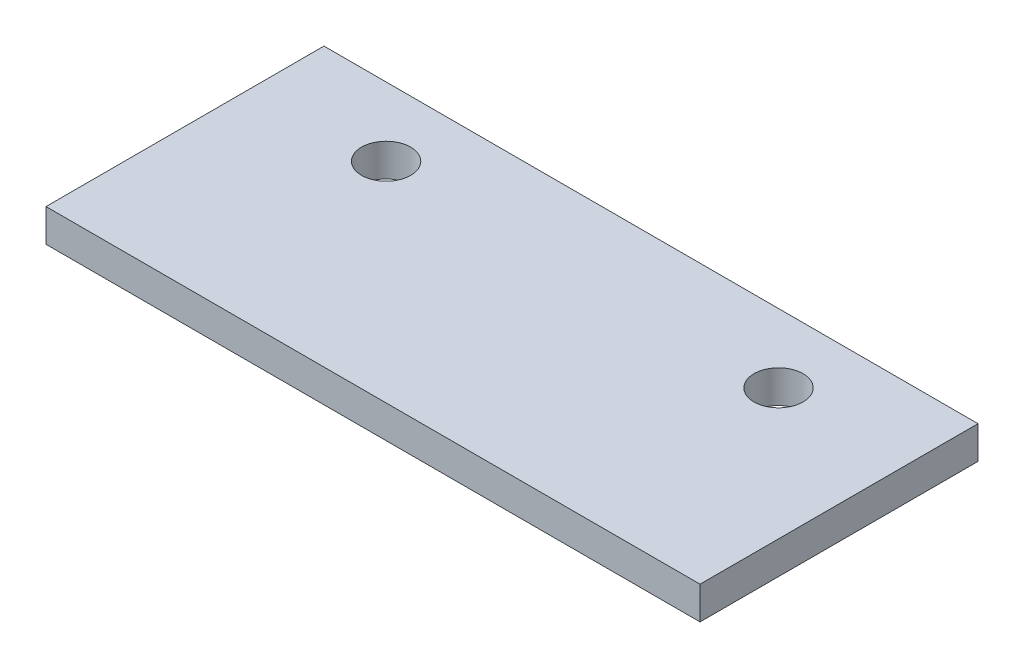
ISO-10303-21;
HEADER;
FILE_DESCRIPTION(('STEP AP214'),'2;1');
FILE_NAME('part.step','',(''),(''),'','','');
FILE_SCHEMA(('AUTOMOTIVE_DESIGN { 1 0 10303 214 1 1 1 1 }'));
ENDSEC;
DATA;
#1=APPLICATION_CONTEXT('core data for automotive mechanical design processes');
#2=APPLICATION_PROTOCOL_DEFINITION('international standard','automotive_design',2000,#1);
#3=PRODUCT_CONTEXT('',#1,'mechanical');
#4=PRODUCT('Part','Part','',(#3));
#5=PRODUCT_RELATED_PRODUCT_CATEGORY('part','',(#4));
#6=PRODUCT_DEFINITION_FORMATION('','',#4);
#7=PRODUCT_DEFINITION_CONTEXT('part definition',#1,'design');
#8=PRODUCT_DEFINITION('design','',#6,#7);
#9=PRODUCT_DEFINITION_SHAPE('','',#8);
#10=(LENGTH_UNIT() NAMED_UNIT(*) SI_UNIT(.MILLI.,.METRE.));
#11=(NAMED_UNIT(*) PLANE_ANGLE_UNIT() SI_UNIT($,.RADIAN.));
#12=(NAMED_UNIT(*) SI_UNIT($,.STERADIAN.) SOLID_ANGLE_UNIT());
#13=UNCERTAINTY_MEASURE_WITH_UNIT(LENGTH_MEASURE(1.E-05),#10,'distance_accuracy_value','');
#14=(GEOMETRIC_REPRESENTATION_CONTEXT(3) GLOBAL_UNCERTAINTY_ASSIGNED_CONTEXT((#13)) GLOBAL_UNIT_ASSIGNED_CONTEXT((#10,
#11,#12)) REPRESENTATION_CONTEXT('',''));
#15=CARTESIAN_POINT('',(0.,0.,0.));
#16=DIRECTION('',(0.,0.,1.));
#17=DIRECTION('',(1.,0.,0.));
#18=AXIS2_PLACEMENT_3D('',#15,#16,#17);
#19=CARTESIAN_POINT('',(-100.,10.,42.5));
#20=DIRECTION('',(1.,0.,0.));
#21=DIRECTION('',(0.,0.,-1.));
#22=AXIS2_PLACEMENT_3D('',#19,#20,#21);
#23=PLANE('',#22);
#24=DIRECTION('',(0.,0.,1.));
#25=VECTOR('',#24,1.);
#26=CARTESIAN_POINT('',(-100.,0.,42.5));
#27=LINE('',#26,#25);
#28=CARTESIAN_POINT('',(-100.,0.,-42.5));
#29=VERTEX_POINT('',#28);
#30=CARTESIAN_POINT('',(-100.,0.,42.5));
#31=VERTEX_POINT('',#30);
#32=EDGE_CURVE('E97',#29,#31,#27,.T.);
#33=ORIENTED_EDGE('',*,*,#32,.T.);
#34=DIRECTION('',(0.,-1.,0.));
#35=VECTOR('',#34,1.);
#36=CARTESIAN_POINT('',(-100.,10.,42.5));
#37=LINE('',#36,#35);
#38=CARTESIAN_POINT('',(-100.,10.,42.5));
#39=VERTEX_POINT('',#38);
#40=EDGE_CURVE('E11',#39,#31,#37,.T.);
#41=ORIENTED_EDGE('',*,*,#40,.F.);
#42=DIRECTION('',(0.,0.,1.));
#43=VECTOR('',#42,1.);
#44=CARTESIAN_POINT('',(-100.,10.,42.5));
#45=LINE('',#44,#43);
#46=CARTESIAN_POINT('',(-100.,10.,-42.5));
#47=VERTEX_POINT('',#46);
#48=EDGE_CURVE('E85',#47,#39,#45,.T.);
#49=ORIENTED_EDGE('',*,*,#48,.F.);
#50=DIRECTION('',(0.,-1.,0.));
#51=VECTOR('',#50,1.);
#52=CARTESIAN_POINT('',(-100.,10.,-42.5));
#53=LINE('',#52,#51);
#54=EDGE_CURVE('E93',#47,#29,#53,.T.);
#55=ORIENTED_EDGE('',*,*,#54,.T.);
#56=EDGE_LOOP('',(#33,#41,#49,#55));
#57=FACE_BOUND('',#56,.T.);
#58=ADVANCED_FACE('F34',(#57),#23,.F.);
#59=CARTESIAN_POINT('',(100.,10.,42.5));
#60=DIRECTION('',(0.,0.,-1.));
#61=DIRECTION('',(-1.,0.,0.));
#62=AXIS2_PLACEMENT_3D('',#59,#60,#61);
#63=PLANE('',#62);
#64=DIRECTION('',(1.,0.,0.));
#65=VECTOR('',#64,1.);
#66=CARTESIAN_POINT('',(100.,0.,42.5));
#67=LINE('',#66,#65);
#68=CARTESIAN_POINT('',(100.,0.,42.5));
#69=VERTEX_POINT('',#68);
#70=EDGE_CURVE('E89',#31,#69,#67,.T.);
#71=ORIENTED_EDGE('',*,*,#70,.T.);
#72=DIRECTION('',(0.,-1.,0.));
#73=VECTOR('',#72,1.);
#74=CARTESIAN_POINT('',(100.,10.,42.5));
#75=LINE('',#74,#73);
#76=CARTESIAN_POINT('',(100.,10.,42.5));
#77=VERTEX_POINT('',#76);
#78=EDGE_CURVE('E42',#77,#69,#75,.T.);
#79=ORIENTED_EDGE('',*,*,#78,.F.);
#80=DIRECTION('',(1.,0.,0.));
#81=VECTOR('',#80,1.);
#82=CARTESIAN_POINT('',(100.,10.,42.5));
#83=LINE('',#82,#81);
#84=EDGE_CURVE('E80',#39,#77,#83,.T.);
#85=ORIENTED_EDGE('',*,*,#84,.F.);
#86=ORIENTED_EDGE('',*,*,#40,.T.);
#87=EDGE_LOOP('',(#71,#79,#85,#86));
#88=FACE_BOUND('',#87,.T.);
#89=ADVANCED_FACE('F88',(#88),#63,.F.);
#90=CARTESIAN_POINT('',(100.,10.,42.5));
#91=DIRECTION('',(-1.,0.,0.));
#92=DIRECTION('',(0.,0.,1.));
#93=AXIS2_PLACEMENT_3D('',#90,#91,#92);
#94=PLANE('',#93);
#95=DIRECTION('',(0.,0.,-1.));
#96=VECTOR('',#95,1.);
#97=CARTESIAN_POINT('',(100.,0.,42.5));
#98=LINE('',#97,#96);
#99=CARTESIAN_POINT('',(100.,0.,-42.5));
#100=VERTEX_POINT('',#99);
#101=EDGE_CURVE('E67',#69,#100,#98,.T.);
#102=ORIENTED_EDGE('',*,*,#101,.T.);
#103=DIRECTION('',(0.,-1.,0.));
#104=VECTOR('',#103,1.);
#105=CARTESIAN_POINT('',(100.,10.,-42.5));
#106=LINE('',#105,#104);
#107=CARTESIAN_POINT('',(100.,10.,-42.5));
#108=VERTEX_POINT('',#107);
#109=EDGE_CURVE('E90',#108,#100,#106,.T.);
#110=ORIENTED_EDGE('',*,*,#109,.F.);
#111=DIRECTION('',(0.,0.,-1.));
#112=VECTOR('',#111,1.);
#113=CARTESIAN_POINT('',(100.,10.,42.5));
#114=LINE('',#113,#112);
#115=EDGE_CURVE('E83',#77,#108,#114,.T.);
#116=ORIENTED_EDGE('',*,*,#115,.F.);
#117=ORIENTED_EDGE('',*,*,#78,.T.);
#118=EDGE_LOOP('',(#102,#110,#116,#117));
#119=FACE_BOUND('',#118,.T.);
#120=ADVANCED_FACE('F91',(#119),#94,.F.);
#121=CARTESIAN_POINT('',(100.,10.,-42.5));
#122=DIRECTION('',(0.,0.,1.));
#123=DIRECTION('',(1.,0.,0.));
#124=AXIS2_PLACEMENT_3D('',#121,#122,#123);
#125=PLANE('',#124);
#126=DIRECTION('',(-1.,0.,0.));
#127=VECTOR('',#126,1.);
#128=CARTESIAN_POINT('',(100.,0.,-42.5));
#129=LINE('',#128,#127);
#130=EDGE_CURVE('E73',#100,#29,#129,.T.);
#131=ORIENTED_EDGE('',*,*,#130,.T.);
#132=ORIENTED_EDGE('',*,*,#54,.F.);
#133=DIRECTION('',(-1.,0.,0.));
#134=VECTOR('',#133,1.);
#135=CARTESIAN_POINT('',(100.,10.,-42.5));
#136=LINE('',#135,#134);
#137=EDGE_CURVE('E50',#108,#47,#136,.T.);
#138=ORIENTED_EDGE('',*,*,#137,.F.);
#139=ORIENTED_EDGE('',*,*,#109,.T.);
#140=EDGE_LOOP('',(#131,#132,#138,#139));
#141=FACE_BOUND('',#140,.T.);
#142=ADVANCED_FACE('F105',(#141),#125,.F.);
#143=CARTESIAN_POINT('',(0.,10.,0.));
#144=DIRECTION('',(0.,1.,0.));
#145=DIRECTION('',(0.,0.,1.));
#146=AXIS2_PLACEMENT_3D('',#143,#144,#145);
#147=PLANE('',#146);
#148=CARTESIAN_POINT('',(60.,10.,-21.5));
#149=DIRECTION('',(0.,-1.,0.));
#150=DIRECTION('',(0.,0.,1.));
#151=AXIS2_PLACEMENT_3D('',#148,#149,#150);
#152=CIRCLE('',#151,7.5);
#153=CARTESIAN_POINT('',(60.,10.,-14.));
#154=VERTEX_POINT('',#153);
#155=EDGE_CURVE('E117',#154,#154,#152,.T.);
#156=ORIENTED_EDGE('',*,*,#155,.T.);
#157=EDGE_LOOP('',(#156));
#158=FACE_BOUND('',#157,.T.);
#159=CARTESIAN_POINT('',(-60.,10.,-21.5));
#160=DIRECTION('',(0.,1.,0.));
#161=DIRECTION('',(0.,0.,1.));
#162=AXIS2_PLACEMENT_3D('',#159,#160,#161);
#163=CIRCLE('',#162,7.5);
#164=CARTESIAN_POINT('',(-60.,10.,-14.));
#165=VERTEX_POINT('',#164);
#166=EDGE_CURVE('E111',#165,#165,#163,.T.);
#167=ORIENTED_EDGE('',*,*,#166,.F.);
#168=EDGE_LOOP('',(#167));
#169=FACE_BOUND('',#168,.T.);
#170=ORIENTED_EDGE('',*,*,#48,.T.);
#171=ORIENTED_EDGE('',*,*,#84,.T.);
#172=ORIENTED_EDGE('',*,*,#115,.T.);
#173=ORIENTED_EDGE('',*,*,#137,.T.);
#174=EDGE_LOOP('',(#170,#171,#172,#173));
#175=FACE_BOUND('',#174,.T.);
#176=ADVANCED_FACE('F81',(#158,#169,#175),#147,.T.);
#177=CARTESIAN_POINT('',(0.,0.,0.));
#178=DIRECTION('',(0.,1.,0.));
#179=DIRECTION('',(0.,0.,1.));
#180=AXIS2_PLACEMENT_3D('',#177,#178,#179);
#181=PLANE('',#180);
#182=CARTESIAN_POINT('',(60.,0.,-21.5));
#183=DIRECTION('',(0.,-1.,0.));
#184=DIRECTION('',(0.,0.,1.));
#185=AXIS2_PLACEMENT_3D('',#182,#183,#184);
#186=CIRCLE('',#185,7.5);
#187=CARTESIAN_POINT('',(60.,0.,-14.));
#188=VERTEX_POINT('',#187);
#189=EDGE_CURVE('E114',#188,#188,#186,.T.);
#190=ORIENTED_EDGE('',*,*,#189,.F.);
#191=EDGE_LOOP('',(#190));
#192=FACE_BOUND('',#191,.T.);
#193=CARTESIAN_POINT('',(-60.,0.,-21.5));
#194=DIRECTION('',(0.,1.,0.));
#195=DIRECTION('',(0.,0.,1.));
#196=AXIS2_PLACEMENT_3D('',#193,#194,#195);
#197=CIRCLE('',#196,7.5);
#198=CARTESIAN_POINT('',(-60.,0.,-14.));
#199=VERTEX_POINT('',#198);
#200=EDGE_CURVE('E100',#199,#199,#197,.T.);
#201=ORIENTED_EDGE('',*,*,#200,.T.);
#202=EDGE_LOOP('',(#201));
#203=FACE_BOUND('',#202,.T.);
#204=ORIENTED_EDGE('',*,*,#32,.F.);
#205=ORIENTED_EDGE('',*,*,#130,.F.);
#206=ORIENTED_EDGE('',*,*,#101,.F.);
#207=ORIENTED_EDGE('',*,*,#70,.F.);
#208=EDGE_LOOP('',(#204,#205,#206,#207));
#209=FACE_BOUND('',#208,.T.);
#210=ADVANCED_FACE('F108',(#192,#203,#209),#181,.F.);
#211=CARTESIAN_POINT('',(-60.,0.,-21.5));
#212=DIRECTION('',(0.,1.,0.));
#213=DIRECTION('',(0.,0.,1.));
#214=AXIS2_PLACEMENT_3D('',#211,#212,#213);
#215=CYLINDRICAL_SURFACE('',#214,7.5);
#216=ORIENTED_EDGE('',*,*,#200,.F.);
#217=EDGE_LOOP('',(#216));
#218=FACE_BOUND('',#217,.T.);
#219=ORIENTED_EDGE('',*,*,#166,.T.);
#220=EDGE_LOOP('',(#219));
#221=FACE_BOUND('',#220,.T.);
#222=ADVANCED_FACE('F128',(#218,#221),#215,.F.);
#223=CARTESIAN_POINT('',(60.,0.,-21.5));
#224=DIRECTION('',(0.,1.,0.));
#225=DIRECTION('',(0.,0.,1.));
#226=AXIS2_PLACEMENT_3D('',#223,#224,#225);
#227=CYLINDRICAL_SURFACE('',#226,7.5);
#228=ORIENTED_EDGE('',*,*,#189,.T.);
#229=EDGE_LOOP('',(#228));
#230=FACE_BOUND('',#229,.T.);
#231=ORIENTED_EDGE('',*,*,#155,.F.);
#232=EDGE_LOOP('',(#231));
#233=FACE_BOUND('',#232,.T.);
#234=ADVANCED_FACE('F123',(#230,#233),#227,.F.);
#235=CLOSED_SHELL('',(#58,#89,#120,#142,#176,#210,#222,#234));
#236=MANIFOLD_SOLID_BREP('B2',#235);
#237=ADVANCED_BREP_SHAPE_REPRESENTATION('',(#18,#236),#14);
#238=SHAPE_DEFINITION_REPRESENTATION(#9,#237);
ENDSEC;
END-ISO-10303-21;
